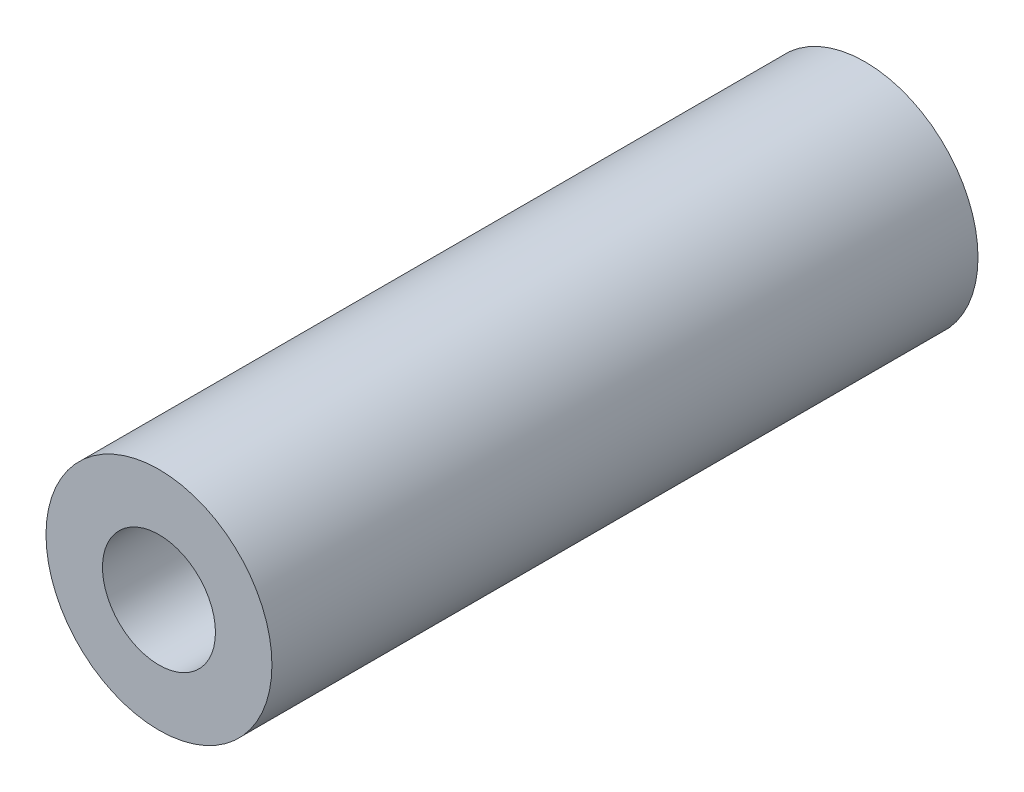
ISO-10303-21;
HEADER;
FILE_DESCRIPTION(('STEP AP214'),'2;1');
FILE_NAME('part.step','',(''),(''),'','','');
FILE_SCHEMA(('AUTOMOTIVE_DESIGN { 1 0 10303 214 1 1 1 1 }'));
ENDSEC;
DATA;
#1=APPLICATION_CONTEXT('core data for automotive mechanical design processes');
#2=APPLICATION_PROTOCOL_DEFINITION('international standard','automotive_design',2000,#1);
#3=PRODUCT_CONTEXT('',#1,'mechanical');
#4=PRODUCT('Part','Part','',(#3));
#5=PRODUCT_RELATED_PRODUCT_CATEGORY('part','',(#4));
#6=PRODUCT_DEFINITION_FORMATION('','',#4);
#7=PRODUCT_DEFINITION_CONTEXT('part definition',#1,'design');
#8=PRODUCT_DEFINITION('design','',#6,#7);
#9=PRODUCT_DEFINITION_SHAPE('','',#8);
#10=(LENGTH_UNIT() NAMED_UNIT(*) SI_UNIT(.MILLI.,.METRE.));
#11=(NAMED_UNIT(*) PLANE_ANGLE_UNIT() SI_UNIT($,.RADIAN.));
#12=(NAMED_UNIT(*) SI_UNIT($,.STERADIAN.) SOLID_ANGLE_UNIT());
#13=UNCERTAINTY_MEASURE_WITH_UNIT(LENGTH_MEASURE(1.E-05),#10,'distance_accuracy_value','');
#14=(GEOMETRIC_REPRESENTATION_CONTEXT(3) GLOBAL_UNCERTAINTY_ASSIGNED_CONTEXT((#13)) GLOBAL_UNIT_ASSIGNED_CONTEXT((#10,
#11,#12)) REPRESENTATION_CONTEXT('',''));
#15=CARTESIAN_POINT('',(0.,0.,0.));
#16=DIRECTION('',(0.,0.,1.));
#17=DIRECTION('',(1.,0.,0.));
#18=AXIS2_PLACEMENT_3D('',#15,#16,#17);
#19=CARTESIAN_POINT('',(0.,0.,31.75));
#20=DIRECTION('',(0.,0.,1.));
#21=DIRECTION('',(1.,0.,0.));
#22=AXIS2_PLACEMENT_3D('',#19,#20,#21);
#23=PLANE('',#22);
#24=CARTESIAN_POINT('',(0.,0.,31.75));
#25=DIRECTION('',(0.,0.,1.));
#26=DIRECTION('',(1.,0.,0.));
#27=AXIS2_PLACEMENT_3D('',#24,#25,#26);
#28=CIRCLE('',#27,5.08);
#29=CARTESIAN_POINT('',(5.08,0.,31.75));
#30=VERTEX_POINT('',#29);
#31=EDGE_CURVE('E10',#30,#30,#28,.T.);
#32=ORIENTED_EDGE('',*,*,#31,.T.);
#33=EDGE_LOOP('',(#32));
#34=FACE_BOUND('',#33,.T.);
#35=CARTESIAN_POINT('',(0.,0.,31.75));
#36=DIRECTION('',(0.,0.,1.));
#37=DIRECTION('',(1.,0.,0.));
#38=AXIS2_PLACEMENT_3D('',#35,#36,#37);
#39=CIRCLE('',#38,2.54);
#40=CARTESIAN_POINT('',(2.54,0.,31.75));
#41=VERTEX_POINT('',#40);
#42=EDGE_CURVE('E42',#41,#41,#39,.T.);
#43=ORIENTED_EDGE('',*,*,#42,.F.);
#44=EDGE_LOOP('',(#43));
#45=FACE_BOUND('',#44,.T.);
#46=ADVANCED_FACE('F31',(#34,#45),#23,.T.);
#47=CARTESIAN_POINT('',(0.,0.,0.));
#48=DIRECTION('',(0.,0.,1.));
#49=DIRECTION('',(1.,0.,0.));
#50=AXIS2_PLACEMENT_3D('',#47,#48,#49);
#51=PLANE('',#50);
#52=CARTESIAN_POINT('',(0.,0.,0.));
#53=DIRECTION('',(0.,0.,1.));
#54=DIRECTION('',(1.,0.,0.));
#55=AXIS2_PLACEMENT_3D('',#52,#53,#54);
#56=CIRCLE('',#55,5.08);
#57=CARTESIAN_POINT('',(5.08,0.,0.));
#58=VERTEX_POINT('',#57);
#59=EDGE_CURVE('E35',#58,#58,#56,.T.);
#60=ORIENTED_EDGE('',*,*,#59,.F.);
#61=EDGE_LOOP('',(#60));
#62=FACE_BOUND('',#61,.T.);
#63=CARTESIAN_POINT('',(0.,0.,0.));
#64=DIRECTION('',(0.,0.,1.));
#65=DIRECTION('',(1.,0.,0.));
#66=AXIS2_PLACEMENT_3D('',#63,#64,#65);
#67=CIRCLE('',#66,2.54);
#68=CARTESIAN_POINT('',(2.54,0.,0.));
#69=VERTEX_POINT('',#68);
#70=EDGE_CURVE('E44',#69,#69,#67,.T.);
#71=ORIENTED_EDGE('',*,*,#70,.T.);
#72=EDGE_LOOP('',(#71));
#73=FACE_BOUND('',#72,.T.);
#74=ADVANCED_FACE('F54',(#62,#73),#51,.F.);
#75=CARTESIAN_POINT('',(0.,0.,31.75));
#76=DIRECTION('',(0.,0.,-1.));
#77=DIRECTION('',(-1.,0.,0.));
#78=AXIS2_PLACEMENT_3D('',#75,#76,#77);
#79=CYLINDRICAL_SURFACE('',#78,5.08);
#80=ORIENTED_EDGE('',*,*,#31,.F.);
#81=EDGE_LOOP('',(#80));
#82=FACE_BOUND('',#81,.T.);
#83=ORIENTED_EDGE('',*,*,#59,.T.);
#84=EDGE_LOOP('',(#83));
#85=FACE_BOUND('',#84,.T.);
#86=ADVANCED_FACE('F33',(#82,#85),#79,.T.);
#87=CARTESIAN_POINT('',(0.,0.,31.75));
#88=DIRECTION('',(0.,0.,-1.));
#89=DIRECTION('',(-1.,0.,0.));
#90=AXIS2_PLACEMENT_3D('',#87,#88,#89);
#91=CYLINDRICAL_SURFACE('',#90,2.54);
#92=ORIENTED_EDGE('',*,*,#42,.T.);
#93=EDGE_LOOP('',(#92));
#94=FACE_BOUND('',#93,.T.);
#95=ORIENTED_EDGE('',*,*,#70,.F.);
#96=EDGE_LOOP('',(#95));
#97=FACE_BOUND('',#96,.T.);
#98=ADVANCED_FACE('F50',(#94,#97),#91,.F.);
#99=CLOSED_SHELL('',(#46,#74,#86,#98));
#100=MANIFOLD_SOLID_BREP('B2',#99);
#101=ADVANCED_BREP_SHAPE_REPRESENTATION('',(#18,#100),#14);
#102=SHAPE_DEFINITION_REPRESENTATION(#9,#101);
ENDSEC;
END-ISO-10303-21;
